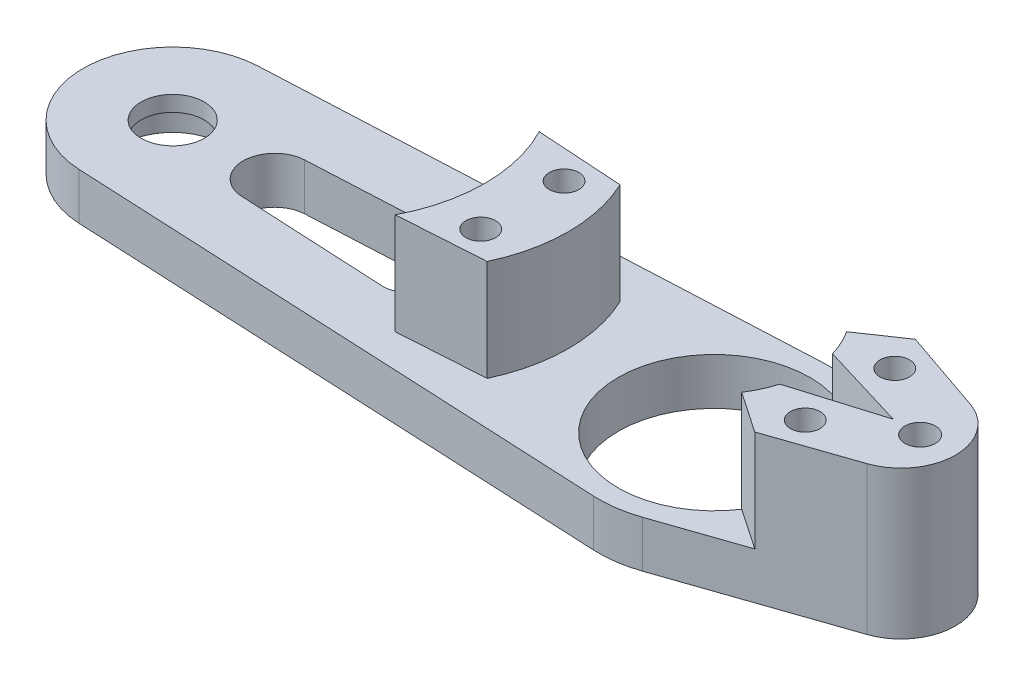
ISO-10303-21;
HEADER;
FILE_DESCRIPTION(('STEP AP214'),'2;1');
FILE_NAME('part.step','',(''),(''),'','','');
FILE_SCHEMA(('AUTOMOTIVE_DESIGN { 1 0 10303 214 1 1 1 1 }'));
ENDSEC;
DATA;
#1=APPLICATION_CONTEXT('core data for automotive mechanical design processes');
#2=APPLICATION_PROTOCOL_DEFINITION('international standard','automotive_design',2000,#1);
#3=PRODUCT_CONTEXT('',#1,'mechanical');
#4=PRODUCT('Part','Part','',(#3));
#5=PRODUCT_RELATED_PRODUCT_CATEGORY('part','',(#4));
#6=PRODUCT_DEFINITION_FORMATION('','',#4);
#7=PRODUCT_DEFINITION_CONTEXT('part definition',#1,'design');
#8=PRODUCT_DEFINITION('design','',#6,#7);
#9=PRODUCT_DEFINITION_SHAPE('','',#8);
#10=(LENGTH_UNIT() NAMED_UNIT(*) SI_UNIT(.MILLI.,.METRE.));
#11=(NAMED_UNIT(*) PLANE_ANGLE_UNIT() SI_UNIT($,.RADIAN.));
#12=(NAMED_UNIT(*) SI_UNIT($,.STERADIAN.) SOLID_ANGLE_UNIT());
#13=UNCERTAINTY_MEASURE_WITH_UNIT(LENGTH_MEASURE(1.E-05),#10,'distance_accuracy_value','');
#14=(GEOMETRIC_REPRESENTATION_CONTEXT(3) GLOBAL_UNCERTAINTY_ASSIGNED_CONTEXT((#13)) GLOBAL_UNIT_ASSIGNED_CONTEXT((#10,
#11,#12)) REPRESENTATION_CONTEXT('',''));
#15=CARTESIAN_POINT('',(0.,0.,0.));
#16=DIRECTION('',(0.,0.,1.));
#17=DIRECTION('',(1.,0.,0.));
#18=AXIS2_PLACEMENT_3D('',#15,#16,#17);
#19=CARTESIAN_POINT('',(0.,6.,0.));
#20=DIRECTION('',(0.,1.,0.));
#21=DIRECTION('',(0.,0.,1.));
#22=AXIS2_PLACEMENT_3D('',#19,#20,#21);
#23=PLANE('',#22);
#24=DIRECTION('',(-0.997936865079172,0.,-0.0642029073792971));
#25=VECTOR('',#24,1.);
#26=CARTESIAN_POINT('',(37.8102487579293,6.,-9.24346624898723));
#27=LINE('',#26,#25);
#28=CARTESIAN_POINT('',(48.9,6.,-8.53));
#29=VERTEX_POINT('',#28);
#30=CARTESIAN_POINT('',(37.8102487579293,6.,-9.24346624898723));
#31=VERTEX_POINT('',#30);
#32=EDGE_CURVE('E298',#29,#31,#27,.T.);
#33=ORIENTED_EDGE('',*,*,#32,.F.);
#34=CARTESIAN_POINT('',(30.8102487579293,6.,0.));
#35=DIRECTION('',(0.,1.,0.));
#36=DIRECTION('',(0.,0.,1.));
#37=AXIS2_PLACEMENT_3D('',#34,#35,#36);
#38=CIRCLE('',#37,20.);
#39=CARTESIAN_POINT('',(48.9,6.,8.53));
#40=VERTEX_POINT('',#39);
#41=EDGE_CURVE('E284',#40,#29,#38,.T.);
#42=ORIENTED_EDGE('',*,*,#41,.F.);
#43=DIRECTION('',(0.997936865079172,0.,-0.0642029073792968));
#44=VECTOR('',#43,1.);
#45=CARTESIAN_POINT('',(37.8102487579293,6.,9.24346624898723));
#46=LINE('',#45,#44);
#47=CARTESIAN_POINT('',(37.8102487579293,6.,9.24346624898723));
#48=VERTEX_POINT('',#47);
#49=EDGE_CURVE('E289',#48,#40,#46,.T.);
#50=ORIENTED_EDGE('',*,*,#49,.F.);
#51=CARTESIAN_POINT('',(20.0744563678545,6.,0.));
#52=DIRECTION('',(0.,-1.,0.));
#53=DIRECTION('',(0.,0.,1.));
#54=AXIS2_PLACEMENT_3D('',#51,#52,#53);
#55=CIRCLE('',#54,20.);
#56=EDGE_CURVE('E300',#31,#48,#55,.T.);
#57=ORIENTED_EDGE('',*,*,#56,.F.);
#58=EDGE_LOOP('',(#33,#42,#50,#57));
#59=FACE_BOUND('',#58,.T.);
#60=CARTESIAN_POINT('',(13.1,6.,0.));
#61=DIRECTION('',(0.,1.,0.));
#62=DIRECTION('',(0.,0.,1.));
#63=AXIS2_PLACEMENT_3D('',#60,#61,#62);
#64=CIRCLE('',#63,4.05);
#65=CARTESIAN_POINT('',(12.8981621805094,6.,-4.04496742812884));
#66=VERTEX_POINT('',#65);
#67=CARTESIAN_POINT('',(12.8981621805094,6.,4.04496742812884));
#68=VERTEX_POINT('',#67);
#69=EDGE_CURVE('E335',#66,#68,#64,.T.);
#70=ORIENTED_EDGE('',*,*,#69,.F.);
#71=DIRECTION('',(0.998757389661443,0.,-0.0498364986396635));
#72=VECTOR('',#71,1.);
#73=CARTESIAN_POINT('',(-0.169301656074376,6.,-3.39292054421391));
#74=LINE('',#73,#72);
#75=CARTESIAN_POINT('',(31.9754087534008,6.,-4.99689347415361));
#76=VERTEX_POINT('',#75);
#77=EDGE_CURVE('E338',#66,#76,#74,.T.);
#78=ORIENTED_EDGE('',*,*,#77,.T.);
#79=CARTESIAN_POINT('',(32.1,6.,-2.5));
#80=DIRECTION('',(0.,1.,0.));
#81=DIRECTION('',(0.,0.,1.));
#82=AXIS2_PLACEMENT_3D('',#79,#80,#81);
#83=CIRCLE('',#82,2.5);
#84=CARTESIAN_POINT('',(34.6,6.,-2.5));
#85=VERTEX_POINT('',#84);
#86=EDGE_CURVE('E340',#85,#76,#83,.T.);
#87=ORIENTED_EDGE('',*,*,#86,.F.);
#88=DIRECTION('',(0.,0.,1.));
#89=VECTOR('',#88,1.);
#90=CARTESIAN_POINT('',(34.6,6.,0.));
#91=LINE('',#90,#89);
#92=CARTESIAN_POINT('',(34.6,6.,2.5));
#93=VERTEX_POINT('',#92);
#94=EDGE_CURVE('E343',#85,#93,#91,.T.);
#95=ORIENTED_EDGE('',*,*,#94,.T.);
#96=CARTESIAN_POINT('',(32.1,6.,2.5));
#97=DIRECTION('',(0.,1.,0.));
#98=DIRECTION('',(0.,0.,1.));
#99=AXIS2_PLACEMENT_3D('',#96,#97,#98);
#100=CIRCLE('',#99,2.5);
#101=CARTESIAN_POINT('',(31.9754087534008,6.,4.99689347415361));
#102=VERTEX_POINT('',#101);
#103=EDGE_CURVE('E345',#102,#93,#100,.T.);
#104=ORIENTED_EDGE('',*,*,#103,.F.);
#105=DIRECTION('',(-0.998757389661443,0.,-0.0498364986396635));
#106=VECTOR('',#105,1.);
#107=CARTESIAN_POINT('',(-0.169301656074376,6.,3.39292054421391));
#108=LINE('',#107,#106);
#109=EDGE_CURVE('E348',#102,#68,#108,.T.);
#110=ORIENTED_EDGE('',*,*,#109,.T.);
#111=EDGE_LOOP('',(#70,#78,#87,#95,#104,#110));
#112=FACE_BOUND('',#111,.T.);
#113=CARTESIAN_POINT('',(0.,6.,0.));
#114=DIRECTION('',(0.,1.,0.));
#115=DIRECTION('',(0.,0.,1.));
#116=AXIS2_PLACEMENT_3D('',#113,#114,#115);
#117=CIRCLE('',#116,4.05);
#118=CARTESIAN_POINT('',(0.,6.,4.05));
#119=VERTEX_POINT('',#118);
#120=EDGE_CURVE('E350',#119,#119,#117,.T.);
#121=ORIENTED_EDGE('',*,*,#120,.F.);
#122=EDGE_LOOP('',(#121));
#123=FACE_BOUND('',#122,.T.);
#124=CARTESIAN_POINT('',(69.5,6.,0.));
#125=DIRECTION('',(0.,1.,0.));
#126=DIRECTION('',(0.,0.,1.));
#127=AXIS2_PLACEMENT_3D('',#124,#125,#126);
#128=CIRCLE('',#127,12.3);
#129=CARTESIAN_POINT('',(79.7909125879284,6.,-6.73699622291838));
#130=VERTEX_POINT('',#129);
#131=CARTESIAN_POINT('',(79.7909125879284,6.,6.73699622291837));
#132=VERTEX_POINT('',#131);
#133=EDGE_CURVE('E353',#130,#132,#128,.T.);
#134=ORIENTED_EDGE('',*,*,#133,.F.);
#135=DIRECTION('',(-0.826911337757205,0.,0.562332321219925));
#136=VECTOR('',#135,1.);
#137=CARTESIAN_POINT('',(85.0425,6.,-10.3082827740609));
#138=LINE('',#137,#136);
#139=CARTESIAN_POINT('',(85.0425,6.,-10.3082827740609));
#140=VERTEX_POINT('',#139);
#141=EDGE_CURVE('E54',#140,#130,#138,.T.);
#142=ORIENTED_EDGE('',*,*,#141,.F.);
#143=DIRECTION('',(0.945714015968887,0.,0.325000000000001));
#144=VECTOR('',#143,1.);
#145=CARTESIAN_POINT('',(12.1509375,6.,-35.3578827720368));
#146=LINE('',#145,#144);
#147=CARTESIAN_POINT('',(74.31,6.,-13.9965674363395));
#148=VERTEX_POINT('',#147);
#149=EDGE_CURVE('E327',#148,#140,#146,.T.);
#150=ORIENTED_EDGE('',*,*,#149,.F.);
#151=CARTESIAN_POINT('',(69.5,6.,0.));
#152=DIRECTION('',(0.,1.,0.));
#153=DIRECTION('',(0.,0.,1.));
#154=AXIS2_PLACEMENT_3D('',#151,#152,#153);
#155=CIRCLE('',#154,14.8);
#156=CARTESIAN_POINT('',(68.7972661870504,6.,-14.7833069774032));
#157=VERTEX_POINT('',#156);
#158=EDGE_CURVE('E324',#148,#157,#155,.T.);
#159=ORIENTED_EDGE('',*,*,#158,.T.);
#160=DIRECTION('',(0.998872093067782,0.,-0.0474820143884893));
#161=VECTOR('',#160,1.);
#162=CARTESIAN_POINT('',(-0.546043165467626,6.,-11.4870290702795));
#163=LINE('',#162,#161);
#164=CARTESIAN_POINT('',(-0.546043165467626,6.,-11.4870290702795));
#165=VERTEX_POINT('',#164);
#166=EDGE_CURVE('E330',#165,#157,#163,.T.);
#167=ORIENTED_EDGE('',*,*,#166,.F.);
#168=CARTESIAN_POINT('',(0.,6.,0.));
#169=DIRECTION('',(0.,1.,0.));
#170=DIRECTION('',(0.,0.,1.));
#171=AXIS2_PLACEMENT_3D('',#168,#169,#170);
#172=CIRCLE('',#171,11.5);
#173=CARTESIAN_POINT('',(-0.546043165467626,6.,11.4870290702795));
#174=VERTEX_POINT('',#173);
#175=EDGE_CURVE('E333',#165,#174,#172,.T.);
#176=ORIENTED_EDGE('',*,*,#175,.T.);
#177=DIRECTION('',(0.998872093067782,0.,0.0474820143884893));
#178=VECTOR('',#177,1.);
#179=CARTESIAN_POINT('',(-0.546043165467626,6.,11.4870290702795));
#180=LINE('',#179,#178);
#181=CARTESIAN_POINT('',(68.7972661870504,6.,14.7833069774032));
#182=VERTEX_POINT('',#181);
#183=EDGE_CURVE('E317',#174,#182,#180,.T.);
#184=ORIENTED_EDGE('',*,*,#183,.T.);
#185=CARTESIAN_POINT('',(74.31,6.,13.9965674363395));
#186=VERTEX_POINT('',#185);
#187=EDGE_CURVE('E320',#182,#186,#155,.T.);
#188=ORIENTED_EDGE('',*,*,#187,.T.);
#189=DIRECTION('',(0.945714015968887,0.,-0.325));
#190=VECTOR('',#189,1.);
#191=CARTESIAN_POINT('',(12.1509375,6.,35.3578827720368));
#192=LINE('',#191,#190);
#193=CARTESIAN_POINT('',(85.0425,6.,10.3082827740609));
#194=VERTEX_POINT('',#193);
#195=EDGE_CURVE('E323',#186,#194,#192,.T.);
#196=ORIENTED_EDGE('',*,*,#195,.T.);
#197=DIRECTION('',(0.826911337757205,0.,0.562332321219926));
#198=VECTOR('',#197,1.);
#199=CARTESIAN_POINT('',(85.0425,6.,10.3082827740609));
#200=LINE('',#199,#198);
#201=EDGE_CURVE('E261',#132,#194,#200,.T.);
#202=ORIENTED_EDGE('',*,*,#201,.F.);
#203=EDGE_LOOP('',(#134,#142,#150,#159,#167,#176,#184,#188,#196,#202));
#204=FACE_BOUND('',#203,.T.);
#205=ADVANCED_FACE('F37',(#59,#112,#123,#204),#23,.T.);
#206=CARTESIAN_POINT('',(81.3244908595363,6.,3.38694787570511));
#207=VERTEX_POINT('',#206);
#208=CARTESIAN_POINT('',(81.3244908595363,6.,-3.3869478757051));
#209=VERTEX_POINT('',#208);
#210=EDGE_CURVE('E215',#207,#209,#128,.T.);
#211=ORIENTED_EDGE('',*,*,#210,.F.);
#212=DIRECTION('',(-0.957014184907747,0.,0.290041117577078));
#213=VECTOR('',#212,1.);
#214=CARTESIAN_POINT('',(81.3244908595363,6.,3.38694787570511));
#215=LINE('',#214,#213);
#216=CARTESIAN_POINT('',(92.5,6.,0.));
#217=VERTEX_POINT('',#216);
#218=EDGE_CURVE('E258',#217,#207,#215,.T.);
#219=ORIENTED_EDGE('',*,*,#218,.F.);
#220=DIRECTION('',(0.957014184907747,0.,0.290041117577078));
#221=VECTOR('',#220,1.);
#222=CARTESIAN_POINT('',(92.5,6.,0.));
#223=LINE('',#222,#221);
#224=EDGE_CURVE('E228',#209,#217,#223,.T.);
#225=ORIENTED_EDGE('',*,*,#224,.F.);
#226=EDGE_LOOP('',(#211,#219,#225));
#227=FACE_BOUND('',#226,.T.);
#228=ADVANCED_FACE('F487',(#227),#23,.T.);
#229=CARTESIAN_POINT('',(13.1,6.,0.));
#230=DIRECTION('',(0.,-1.,0.));
#231=DIRECTION('',(0.,0.,-1.));
#232=AXIS2_PLACEMENT_3D('',#229,#230,#231);
#233=CYLINDRICAL_SURFACE('',#232,4.05);
#234=CARTESIAN_POINT('',(13.1,0.,0.));
#235=DIRECTION('',(0.,1.,0.));
#236=DIRECTION('',(0.,0.,1.));
#237=AXIS2_PLACEMENT_3D('',#234,#235,#236);
#238=CIRCLE('',#237,4.05);
#239=CARTESIAN_POINT('',(12.8981621805094,0.,-4.04496742812884));
#240=VERTEX_POINT('',#239);
#241=CARTESIAN_POINT('',(12.8981621805094,0.,4.04496742812884));
#242=VERTEX_POINT('',#241);
#243=EDGE_CURVE('E374',#240,#242,#238,.T.);
#244=ORIENTED_EDGE('',*,*,#243,.F.);
#245=DIRECTION('',(0.,-1.,0.));
#246=VECTOR('',#245,1.);
#247=CARTESIAN_POINT('',(12.8981621805094,6.,-4.04496742812884));
#248=LINE('',#247,#246);
#249=EDGE_CURVE('E12',#66,#240,#248,.T.);
#250=ORIENTED_EDGE('',*,*,#249,.F.);
#251=ORIENTED_EDGE('',*,*,#69,.T.);
#252=DIRECTION('',(0.,-1.,0.));
#253=VECTOR('',#252,1.);
#254=CARTESIAN_POINT('',(12.8981621805094,6.,4.04496742812884));
#255=LINE('',#254,#253);
#256=EDGE_CURVE('E409',#68,#242,#255,.T.);
#257=ORIENTED_EDGE('',*,*,#256,.T.);
#258=EDGE_LOOP('',(#244,#250,#251,#257));
#259=FACE_BOUND('',#258,.T.);
#260=ADVANCED_FACE('F489',(#259),#233,.F.);
#261=CARTESIAN_POINT('',(-0.169301656074376,6.,-3.39292054421391));
#262=DIRECTION('',(-0.0498364986396635,0.,-0.998757389661442));
#263=DIRECTION('',(-0.998757389661443,0.,0.0498364986396635));
#264=AXIS2_PLACEMENT_3D('',#261,#262,#263);
#265=PLANE('',#264);
#266=DIRECTION('',(0.998757389661443,0.,-0.0498364986396635));
#267=VECTOR('',#266,1.);
#268=CARTESIAN_POINT('',(-0.169301656074376,0.,-3.39292054421391));
#269=LINE('',#268,#267);
#270=CARTESIAN_POINT('',(31.9754087534008,0.,-4.99689347415361));
#271=VERTEX_POINT('',#270);
#272=EDGE_CURVE('E377',#240,#271,#269,.T.);
#273=ORIENTED_EDGE('',*,*,#272,.T.);
#274=DIRECTION('',(0.,-1.,0.));
#275=VECTOR('',#274,1.);
#276=CARTESIAN_POINT('',(31.9754087534008,6.,-4.99689347415361));
#277=LINE('',#276,#275);
#278=EDGE_CURVE('E46',#76,#271,#277,.T.);
#279=ORIENTED_EDGE('',*,*,#278,.F.);
#280=ORIENTED_EDGE('',*,*,#77,.F.);
#281=ORIENTED_EDGE('',*,*,#249,.T.);
#282=EDGE_LOOP('',(#273,#279,#280,#281));
#283=FACE_BOUND('',#282,.T.);
#284=ADVANCED_FACE('F495',(#283),#265,.F.);
#285=CARTESIAN_POINT('',(32.1,6.,-2.5));
#286=DIRECTION('',(0.,-1.,0.));
#287=DIRECTION('',(0.,0.,-1.));
#288=AXIS2_PLACEMENT_3D('',#285,#286,#287);
#289=CYLINDRICAL_SURFACE('',#288,2.5);
#290=CARTESIAN_POINT('',(32.1,0.,-2.5));
#291=DIRECTION('',(0.,1.,0.));
#292=DIRECTION('',(0.,0.,1.));
#293=AXIS2_PLACEMENT_3D('',#290,#291,#292);
#294=CIRCLE('',#293,2.5);
#295=CARTESIAN_POINT('',(34.6,0.,-2.5));
#296=VERTEX_POINT('',#295);
#297=EDGE_CURVE('E380',#296,#271,#294,.T.);
#298=ORIENTED_EDGE('',*,*,#297,.F.);
#299=DIRECTION('',(0.,-1.,0.));
#300=VECTOR('',#299,1.);
#301=CARTESIAN_POINT('',(34.6,6.,-2.5));
#302=LINE('',#301,#300);
#303=EDGE_CURVE('E416',#85,#296,#302,.T.);
#304=ORIENTED_EDGE('',*,*,#303,.F.);
#305=ORIENTED_EDGE('',*,*,#86,.T.);
#306=ORIENTED_EDGE('',*,*,#278,.T.);
#307=EDGE_LOOP('',(#298,#304,#305,#306));
#308=FACE_BOUND('',#307,.T.);
#309=ADVANCED_FACE('F544',(#308),#289,.F.);
#310=CARTESIAN_POINT('',(34.6,6.,0.));
#311=DIRECTION('',(1.,0.,0.));
#312=DIRECTION('',(0.,0.,-1.));
#313=AXIS2_PLACEMENT_3D('',#310,#311,#312);
#314=PLANE('',#313);
#315=DIRECTION('',(0.,0.,1.));
#316=VECTOR('',#315,1.);
#317=CARTESIAN_POINT('',(34.6,0.,0.));
#318=LINE('',#317,#316);
#319=CARTESIAN_POINT('',(34.6,0.,2.5));
#320=VERTEX_POINT('',#319);
#321=EDGE_CURVE('E383',#296,#320,#318,.T.);
#322=ORIENTED_EDGE('',*,*,#321,.T.);
#323=DIRECTION('',(0.,-1.,0.));
#324=VECTOR('',#323,1.);
#325=CARTESIAN_POINT('',(34.6,6.,2.5));
#326=LINE('',#325,#324);
#327=EDGE_CURVE('E414',#93,#320,#326,.T.);
#328=ORIENTED_EDGE('',*,*,#327,.F.);
#329=ORIENTED_EDGE('',*,*,#94,.F.);
#330=ORIENTED_EDGE('',*,*,#303,.T.);
#331=EDGE_LOOP('',(#322,#328,#329,#330));
#332=FACE_BOUND('',#331,.T.);
#333=ADVANCED_FACE('F540',(#332),#314,.F.);
#334=CARTESIAN_POINT('',(32.1,6.,2.5));
#335=DIRECTION('',(0.,-1.,0.));
#336=DIRECTION('',(0.,0.,-1.));
#337=AXIS2_PLACEMENT_3D('',#334,#335,#336);
#338=CYLINDRICAL_SURFACE('',#337,2.5);
#339=CARTESIAN_POINT('',(32.1,0.,2.5));
#340=DIRECTION('',(0.,1.,0.));
#341=DIRECTION('',(0.,0.,1.));
#342=AXIS2_PLACEMENT_3D('',#339,#340,#341);
#343=CIRCLE('',#342,2.5);
#344=CARTESIAN_POINT('',(31.9754087534008,0.,4.99689347415361));
#345=VERTEX_POINT('',#344);
#346=EDGE_CURVE('E386',#345,#320,#343,.T.);
#347=ORIENTED_EDGE('',*,*,#346,.F.);
#348=DIRECTION('',(0.,-1.,0.));
#349=VECTOR('',#348,1.);
#350=CARTESIAN_POINT('',(31.9754087534008,6.,4.99689347415361));
#351=LINE('',#350,#349);
#352=EDGE_CURVE('E411',#102,#345,#351,.T.);
#353=ORIENTED_EDGE('',*,*,#352,.F.);
#354=ORIENTED_EDGE('',*,*,#103,.T.);
#355=ORIENTED_EDGE('',*,*,#327,.T.);
#356=EDGE_LOOP('',(#347,#353,#354,#355));
#357=FACE_BOUND('',#356,.T.);
#358=ADVANCED_FACE('F537',(#357),#338,.F.);
#359=CARTESIAN_POINT('',(-0.546043165467626,6.,11.4870290702795));
#360=DIRECTION('',(0.0474820143884892,0.,-0.998872093067782));
#361=DIRECTION('',(-0.998872093067782,0.,-0.0474820143884893));
#362=AXIS2_PLACEMENT_3D('',#359,#360,#361);
#363=PLANE('',#362);
#364=DIRECTION('',(0.998872093067782,0.,0.0474820143884893));
#365=VECTOR('',#364,1.);
#366=CARTESIAN_POINT('',(-0.546043165467626,0.,11.4870290702795));
#367=LINE('',#366,#365);
#368=CARTESIAN_POINT('',(-0.546043165467626,0.,11.4870290702795));
#369=VERTEX_POINT('',#368);
#370=CARTESIAN_POINT('',(68.7972661870504,0.,14.7833069774032));
#371=VERTEX_POINT('',#370);
#372=EDGE_CURVE('E355',#369,#371,#367,.T.);
#373=ORIENTED_EDGE('',*,*,#372,.T.);
#374=DIRECTION('',(0.,-1.,0.));
#375=VECTOR('',#374,1.);
#376=CARTESIAN_POINT('',(68.7972661870504,6.,14.7833069774032));
#377=LINE('',#376,#375);
#378=EDGE_CURVE('E412',#182,#371,#377,.T.);
#379=ORIENTED_EDGE('',*,*,#378,.F.);
#380=ORIENTED_EDGE('',*,*,#183,.F.);
#381=DIRECTION('',(0.,-1.,0.));
#382=VECTOR('',#381,1.);
#383=CARTESIAN_POINT('',(-0.546043165467626,6.,11.4870290702795));
#384=LINE('',#383,#382);
#385=EDGE_CURVE('E419',#174,#369,#384,.T.);
#386=ORIENTED_EDGE('',*,*,#385,.T.);
#387=EDGE_LOOP('',(#373,#379,#380,#386));
#388=FACE_BOUND('',#387,.T.);
#389=ADVANCED_FACE('F39',(#388),#363,.F.);
#390=CARTESIAN_POINT('',(69.5,6.,0.));
#391=DIRECTION('',(0.,-1.,0.));
#392=DIRECTION('',(0.,0.,-1.));
#393=AXIS2_PLACEMENT_3D('',#390,#391,#392);
#394=CYLINDRICAL_SURFACE('',#393,14.8);
#395=CARTESIAN_POINT('',(69.5,0.,0.));
#396=DIRECTION('',(0.,1.,0.));
#397=DIRECTION('',(0.,0.,1.));
#398=AXIS2_PLACEMENT_3D('',#395,#396,#397);
#399=CIRCLE('',#398,14.8);
#400=CARTESIAN_POINT('',(74.31,0.,13.9965674363395));
#401=VERTEX_POINT('',#400);
#402=EDGE_CURVE('E358',#371,#401,#399,.T.);
#403=ORIENTED_EDGE('',*,*,#402,.T.);
#404=DIRECTION('',(0.,-1.,0.));
#405=VECTOR('',#404,1.);
#406=CARTESIAN_POINT('',(74.31,6.,13.9965674363395));
#407=LINE('',#406,#405);
#408=EDGE_CURVE('E433',#186,#401,#407,.T.);
#409=ORIENTED_EDGE('',*,*,#408,.F.);
#410=ORIENTED_EDGE('',*,*,#187,.F.);
#411=ORIENTED_EDGE('',*,*,#378,.T.);
#412=EDGE_LOOP('',(#403,#409,#410,#411));
#413=FACE_BOUND('',#412,.T.);
#414=ADVANCED_FACE('F438',(#413),#394,.T.);
#415=CARTESIAN_POINT('',(12.1509375,6.,35.3578827720368));
#416=DIRECTION('',(-0.325,0.,-0.945714015968887));
#417=DIRECTION('',(-0.945714015968887,0.,0.325));
#418=AXIS2_PLACEMENT_3D('',#415,#416,#417);
#419=PLANE('',#418);
#420=DIRECTION('',(0.945714015968887,0.,-0.325));
#421=VECTOR('',#420,1.);
#422=CARTESIAN_POINT('',(12.1509375,0.,35.3578827720368));
#423=LINE('',#422,#421);
#424=CARTESIAN_POINT('',(95.775,0.,6.61999811178221));
#425=VERTEX_POINT('',#424);
#426=EDGE_CURVE('E360',#401,#425,#423,.T.);
#427=ORIENTED_EDGE('',*,*,#426,.T.);
#428=DIRECTION('',(0.,-1.,0.));
#429=VECTOR('',#428,1.);
#430=CARTESIAN_POINT('',(95.775,6.,6.61999811178221));
#431=LINE('',#430,#429);
#432=CARTESIAN_POINT('',(95.775,19.,6.61999811178221));
#433=VERTEX_POINT('',#432);
#434=EDGE_CURVE('E430',#433,#425,#431,.T.);
#435=ORIENTED_EDGE('',*,*,#434,.F.);
#436=DIRECTION('',(0.945714015968887,0.,-0.325));
#437=VECTOR('',#436,1.);
#438=CARTESIAN_POINT('',(85.0425,19.,10.3082827740609));
#439=LINE('',#438,#437);
#440=CARTESIAN_POINT('',(85.0425,19.,10.3082827740609));
#441=VERTEX_POINT('',#440);
#442=EDGE_CURVE('E247',#441,#433,#439,.T.);
#443=ORIENTED_EDGE('',*,*,#442,.F.);
#444=DIRECTION('',(0.,-1.,0.));
#445=VECTOR('',#444,1.);
#446=CARTESIAN_POINT('',(85.0425,48.2217226809239,10.3082827740609));
#447=LINE('',#446,#445);
#448=EDGE_CURVE('E268',#441,#194,#447,.T.);
#449=ORIENTED_EDGE('',*,*,#448,.T.);
#450=ORIENTED_EDGE('',*,*,#195,.F.);
#451=ORIENTED_EDGE('',*,*,#408,.T.);
#452=EDGE_LOOP('',(#427,#435,#443,#449,#450,#451));
#453=FACE_BOUND('',#452,.T.);
#454=ADVANCED_FACE('F452',(#453),#419,.F.);
#455=CARTESIAN_POINT('',(93.5,6.,0.));
#456=DIRECTION('',(0.,-1.,0.));
#457=DIRECTION('',(0.,0.,-1.));
#458=AXIS2_PLACEMENT_3D('',#455,#456,#457);
#459=CYLINDRICAL_SURFACE('',#458,7.);
#460=CARTESIAN_POINT('',(93.5,0.,0.));
#461=DIRECTION('',(0.,1.,0.));
#462=DIRECTION('',(0.,0.,1.));
#463=AXIS2_PLACEMENT_3D('',#460,#461,#462);
#464=CIRCLE('',#463,7.);
#465=CARTESIAN_POINT('',(95.775,0.,-6.6199981117822));
#466=VERTEX_POINT('',#465);
#467=EDGE_CURVE('E363',#425,#466,#464,.T.);
#468=ORIENTED_EDGE('',*,*,#467,.T.);
#469=DIRECTION('',(0.,-1.,0.));
#470=VECTOR('',#469,1.);
#471=CARTESIAN_POINT('',(95.775,6.,-6.6199981117822));
#472=LINE('',#471,#470);
#473=CARTESIAN_POINT('',(95.775,19.,-6.6199981117822));
#474=VERTEX_POINT('',#473);
#475=EDGE_CURVE('E428',#474,#466,#472,.T.);
#476=ORIENTED_EDGE('',*,*,#475,.F.);
#477=CARTESIAN_POINT('',(93.5,19.,0.));
#478=DIRECTION('',(0.,1.,0.));
#479=DIRECTION('',(0.,0.,1.));
#480=AXIS2_PLACEMENT_3D('',#477,#478,#479);
#481=CIRCLE('',#480,6.99999999999999);
#482=EDGE_CURVE('E244',#433,#474,#481,.T.);
#483=ORIENTED_EDGE('',*,*,#482,.F.);
#484=ORIENTED_EDGE('',*,*,#434,.T.);
#485=EDGE_LOOP('',(#468,#476,#483,#484));
#486=FACE_BOUND('',#485,.T.);
#487=ADVANCED_FACE('F456',(#486),#459,.T.);
#488=CARTESIAN_POINT('',(12.1509375,6.,-35.3578827720368));
#489=DIRECTION('',(0.325000000000001,0.,-0.945714015968887));
#490=DIRECTION('',(-0.945714015968887,0.,-0.325000000000001));
#491=AXIS2_PLACEMENT_3D('',#488,#489,#490);
#492=PLANE('',#491);
#493=DIRECTION('',(0.945714015968887,0.,0.325000000000001));
#494=VECTOR('',#493,1.);
#495=CARTESIAN_POINT('',(12.1509375,0.,-35.3578827720368));
#496=LINE('',#495,#494);
#497=CARTESIAN_POINT('',(74.31,0.,-13.9965674363395));
#498=VERTEX_POINT('',#497);
#499=EDGE_CURVE('E366',#498,#466,#496,.T.);
#500=ORIENTED_EDGE('',*,*,#499,.F.);
#501=DIRECTION('',(0.,-1.,0.));
#502=VECTOR('',#501,1.);
#503=CARTESIAN_POINT('',(74.31,6.,-13.9965674363395));
#504=LINE('',#503,#502);
#505=EDGE_CURVE('E426',#148,#498,#504,.T.);
#506=ORIENTED_EDGE('',*,*,#505,.F.);
#507=ORIENTED_EDGE('',*,*,#149,.T.);
#508=DIRECTION('',(0.,-1.,0.));
#509=VECTOR('',#508,1.);
#510=CARTESIAN_POINT('',(85.0425,48.2217226809239,-10.3082827740609));
#511=LINE('',#510,#509);
#512=CARTESIAN_POINT('',(85.0425,19.,-10.3082827740609));
#513=VERTEX_POINT('',#512);
#514=EDGE_CURVE('E266',#513,#140,#511,.T.);
#515=ORIENTED_EDGE('',*,*,#514,.F.);
#516=DIRECTION('',(-0.945714015968887,0.,-0.325));
#517=VECTOR('',#516,1.);
#518=CARTESIAN_POINT('',(85.0425,19.,-10.3082827740609));
#519=LINE('',#518,#517);
#520=EDGE_CURVE('E236',#474,#513,#519,.T.);
#521=ORIENTED_EDGE('',*,*,#520,.F.);
#522=ORIENTED_EDGE('',*,*,#475,.T.);
#523=EDGE_LOOP('',(#500,#506,#507,#515,#521,#522));
#524=FACE_BOUND('',#523,.T.);
#525=ADVANCED_FACE('F477',(#524),#492,.T.);
#526=CARTESIAN_POINT('',(68.7972661870504,0.,-14.7833069774032));
#527=VERTEX_POINT('',#526);
#528=EDGE_CURVE('E361',#498,#527,#399,.T.);
#529=ORIENTED_EDGE('',*,*,#528,.T.);
#530=DIRECTION('',(0.,-1.,0.));
#531=VECTOR('',#530,1.);
#532=CARTESIAN_POINT('',(68.7972661870504,6.,-14.7833069774032));
#533=LINE('',#532,#531);
#534=EDGE_CURVE('E424',#157,#527,#533,.T.);
#535=ORIENTED_EDGE('',*,*,#534,.F.);
#536=ORIENTED_EDGE('',*,*,#158,.F.);
#537=ORIENTED_EDGE('',*,*,#505,.T.);
#538=EDGE_LOOP('',(#529,#535,#536,#537));
#539=FACE_BOUND('',#538,.T.);
#540=ADVANCED_FACE('F556',(#539),#394,.T.);
#541=CARTESIAN_POINT('',(-0.546043165467626,6.,-11.4870290702795));
#542=DIRECTION('',(-0.0474820143884892,0.,-0.998872093067782));
#543=DIRECTION('',(-0.998872093067782,0.,0.0474820143884893));
#544=AXIS2_PLACEMENT_3D('',#541,#542,#543);
#545=PLANE('',#544);
#546=DIRECTION('',(0.998872093067782,0.,-0.0474820143884893));
#547=VECTOR('',#546,1.);
#548=CARTESIAN_POINT('',(-0.546043165467626,0.,-11.4870290702795));
#549=LINE('',#548,#547);
#550=CARTESIAN_POINT('',(-0.546043165467626,0.,-11.4870290702795));
#551=VERTEX_POINT('',#550);
#552=EDGE_CURVE('E369',#551,#527,#549,.T.);
#553=ORIENTED_EDGE('',*,*,#552,.F.);
#554=DIRECTION('',(0.,-1.,0.));
#555=VECTOR('',#554,1.);
#556=CARTESIAN_POINT('',(-0.546043165467626,6.,-11.4870290702795));
#557=LINE('',#556,#555);
#558=EDGE_CURVE('E422',#165,#551,#557,.T.);
#559=ORIENTED_EDGE('',*,*,#558,.F.);
#560=ORIENTED_EDGE('',*,*,#166,.T.);
#561=ORIENTED_EDGE('',*,*,#534,.T.);
#562=EDGE_LOOP('',(#553,#559,#560,#561));
#563=FACE_BOUND('',#562,.T.);
#564=ADVANCED_FACE('F470',(#563),#545,.T.);
#565=CARTESIAN_POINT('',(86.96,6.,5.75));
#566=DIRECTION('',(0.,-1.,0.));
#567=DIRECTION('',(0.,0.,-1.));
#568=AXIS2_PLACEMENT_3D('',#565,#566,#567);
#569=CYLINDRICAL_SURFACE('',#568,1.9);
#570=CARTESIAN_POINT('',(86.96,0.,5.75));
#571=DIRECTION('',(0.,1.,0.));
#572=DIRECTION('',(0.,0.,1.));
#573=AXIS2_PLACEMENT_3D('',#570,#571,#572);
#574=CIRCLE('',#573,1.9);
#575=CARTESIAN_POINT('',(86.96,0.,7.65));
#576=VERTEX_POINT('',#575);
#577=EDGE_CURVE('E404',#576,#576,#574,.T.);
#578=ORIENTED_EDGE('',*,*,#577,.F.);
#579=EDGE_LOOP('',(#578));
#580=FACE_BOUND('',#579,.T.);
#581=CARTESIAN_POINT('',(86.96,19.,5.75));
#582=DIRECTION('',(0.,1.,0.));
#583=DIRECTION('',(0.,0.,1.));
#584=AXIS2_PLACEMENT_3D('',#581,#582,#583);
#585=CIRCLE('',#584,1.9);
#586=CARTESIAN_POINT('',(86.96,19.,7.65));
#587=VERTEX_POINT('',#586);
#588=EDGE_CURVE('E239',#587,#587,#585,.T.);
#589=ORIENTED_EDGE('',*,*,#588,.T.);
#590=EDGE_LOOP('',(#589));
#591=FACE_BOUND('',#590,.T.);
#592=ADVANCED_FACE('F511',(#580,#591),#569,.F.);
#593=CARTESIAN_POINT('',(95.96,6.,0.));
#594=DIRECTION('',(0.,-1.,0.));
#595=DIRECTION('',(0.,0.,-1.));
#596=AXIS2_PLACEMENT_3D('',#593,#594,#595);
#597=CYLINDRICAL_SURFACE('',#596,1.95);
#598=CARTESIAN_POINT('',(95.96,0.,0.));
#599=DIRECTION('',(0.,1.,0.));
#600=DIRECTION('',(0.,0.,1.));
#601=AXIS2_PLACEMENT_3D('',#598,#599,#600);
#602=CIRCLE('',#601,1.95);
#603=CARTESIAN_POINT('',(95.96,0.,1.95));
#604=VERTEX_POINT('',#603);
#605=EDGE_CURVE('E401',#604,#604,#602,.T.);
#606=ORIENTED_EDGE('',*,*,#605,.F.);
#607=EDGE_LOOP('',(#606));
#608=FACE_BOUND('',#607,.T.);
#609=CARTESIAN_POINT('',(95.96,19.,0.));
#610=DIRECTION('',(0.,1.,0.));
#611=DIRECTION('',(0.,0.,1.));
#612=AXIS2_PLACEMENT_3D('',#609,#610,#611);
#613=CIRCLE('',#612,1.95);
#614=CARTESIAN_POINT('',(95.96,19.,1.95));
#615=VERTEX_POINT('',#614);
#616=EDGE_CURVE('E276',#615,#615,#613,.T.);
#617=ORIENTED_EDGE('',*,*,#616,.T.);
#618=EDGE_LOOP('',(#617));
#619=FACE_BOUND('',#618,.T.);
#620=ADVANCED_FACE('F514',(#608,#619),#597,.F.);
#621=CARTESIAN_POINT('',(69.5,6.,0.));
#622=DIRECTION('',(0.,-1.,0.));
#623=DIRECTION('',(0.,0.,-1.));
#624=AXIS2_PLACEMENT_3D('',#621,#622,#623);
#625=CYLINDRICAL_SURFACE('',#624,12.3);
#626=ORIENTED_EDGE('',*,*,#133,.T.);
#627=DIRECTION('',(0.,-1.,0.));
#628=VECTOR('',#627,1.);
#629=CARTESIAN_POINT('',(79.7909125879284,48.2217226809239,6.73699622291837));
#630=LINE('',#629,#628);
#631=CARTESIAN_POINT('',(79.7909125879284,19.,6.73699622291837));
#632=VERTEX_POINT('',#631);
#633=EDGE_CURVE('E270',#632,#132,#630,.T.);
#634=ORIENTED_EDGE('',*,*,#633,.F.);
#635=CARTESIAN_POINT('',(69.5,19.,0.));
#636=DIRECTION('',(0.,1.,0.));
#637=DIRECTION('',(0.,0.,1.));
#638=AXIS2_PLACEMENT_3D('',#635,#636,#637);
#639=CIRCLE('',#638,12.3);
#640=CARTESIAN_POINT('',(81.3244908595363,19.,3.38694787570511));
#641=VERTEX_POINT('',#640);
#642=EDGE_CURVE('E253',#641,#632,#639,.F.);
#643=ORIENTED_EDGE('',*,*,#642,.F.);
#644=DIRECTION('',(0.,-1.,0.));
#645=VECTOR('',#644,1.);
#646=CARTESIAN_POINT('',(81.3244908595363,48.2217226809239,3.38694787570511));
#647=LINE('',#646,#645);
#648=EDGE_CURVE('E272',#641,#207,#647,.T.);
#649=ORIENTED_EDGE('',*,*,#648,.T.);
#650=ORIENTED_EDGE('',*,*,#210,.T.);
#651=DIRECTION('',(0.,-1.,0.));
#652=VECTOR('',#651,1.);
#653=CARTESIAN_POINT('',(81.3244908595363,48.2217226809239,-3.3869478757051));
#654=LINE('',#653,#652);
#655=CARTESIAN_POINT('',(81.3244908595363,19.,-3.3869478757051));
#656=VERTEX_POINT('',#655);
#657=EDGE_CURVE('E206',#656,#209,#654,.T.);
#658=ORIENTED_EDGE('',*,*,#657,.F.);
#659=CARTESIAN_POINT('',(69.5,19.,0.));
#660=DIRECTION('',(0.,1.,0.));
#661=DIRECTION('',(0.,0.,1.));
#662=AXIS2_PLACEMENT_3D('',#659,#660,#661);
#663=CIRCLE('',#662,12.3);
#664=CARTESIAN_POINT('',(79.7909125879284,19.,-6.73699622291837));
#665=VERTEX_POINT('',#664);
#666=EDGE_CURVE('E212',#665,#656,#663,.F.);
#667=ORIENTED_EDGE('',*,*,#666,.F.);
#668=DIRECTION('',(0.,-1.,0.));
#669=VECTOR('',#668,1.);
#670=CARTESIAN_POINT('',(79.7909125879284,48.2217226809239,-6.73699622291837));
#671=LINE('',#670,#669);
#672=EDGE_CURVE('E219',#665,#130,#671,.T.);
#673=ORIENTED_EDGE('',*,*,#672,.T.);
#674=EDGE_LOOP('',(#626,#634,#643,#649,#650,#658,#667,#673));
#675=FACE_BOUND('',#674,.T.);
#676=CARTESIAN_POINT('',(69.5,0.,0.));
#677=DIRECTION('',(0.,1.,0.));
#678=DIRECTION('',(0.,0.,1.));
#679=AXIS2_PLACEMENT_3D('',#676,#677,#678);
#680=CIRCLE('',#679,12.3);
#681=CARTESIAN_POINT('',(69.5,0.,12.3));
#682=VERTEX_POINT('',#681);
#683=EDGE_CURVE('E398',#682,#682,#680,.T.);
#684=ORIENTED_EDGE('',*,*,#683,.F.);
#685=EDGE_LOOP('',(#684));
#686=FACE_BOUND('',#685,.T.);
#687=ADVANCED_FACE('F209',(#675,#686),#625,.F.);
#688=CARTESIAN_POINT('',(44.9,6.,5.35));
#689=DIRECTION('',(0.,-1.,0.));
#690=DIRECTION('',(0.,0.,-1.));
#691=AXIS2_PLACEMENT_3D('',#688,#689,#690);
#692=CYLINDRICAL_SURFACE('',#691,1.89999999999998);
#693=CARTESIAN_POINT('',(44.9,0.,5.35));
#694=DIRECTION('',(0.,1.,0.));
#695=DIRECTION('',(0.,0.,1.));
#696=AXIS2_PLACEMENT_3D('',#693,#694,#695);
#697=CIRCLE('',#696,1.89999999999998);
#698=CARTESIAN_POINT('',(44.9,0.,7.24999999999998));
#699=VERTEX_POINT('',#698);
#700=EDGE_CURVE('E395',#699,#699,#697,.T.);
#701=ORIENTED_EDGE('',*,*,#700,.F.);
#702=EDGE_LOOP('',(#701));
#703=FACE_BOUND('',#702,.T.);
#704=CARTESIAN_POINT('',(44.9,19.,5.35));
#705=DIRECTION('',(0.,1.,0.));
#706=DIRECTION('',(0.,0.,1.));
#707=AXIS2_PLACEMENT_3D('',#704,#705,#706);
#708=CIRCLE('',#707,1.9);
#709=CARTESIAN_POINT('',(44.9,19.,7.25));
#710=VERTEX_POINT('',#709);
#711=EDGE_CURVE('E281',#710,#710,#708,.T.);
#712=ORIENTED_EDGE('',*,*,#711,.T.);
#713=EDGE_LOOP('',(#712));
#714=FACE_BOUND('',#713,.T.);
#715=ADVANCED_FACE('F521',(#703,#714),#692,.F.);
#716=CARTESIAN_POINT('',(0.,6.,0.));
#717=DIRECTION('',(0.,-1.,0.));
#718=DIRECTION('',(0.,0.,-1.));
#719=AXIS2_PLACEMENT_3D('',#716,#717,#718);
#720=CYLINDRICAL_SURFACE('',#719,4.05);
#721=CARTESIAN_POINT('',(0.,4.,0.));
#722=DIRECTION('',(0.,1.,0.));
#723=DIRECTION('',(0.,0.,1.));
#724=AXIS2_PLACEMENT_3D('',#721,#722,#723);
#725=CIRCLE('',#724,4.05);
#726=CARTESIAN_POINT('',(0.,4.,4.05));
#727=VERTEX_POINT('',#726);
#728=EDGE_CURVE('E41',#727,#727,#725,.T.);
#729=ORIENTED_EDGE('',*,*,#728,.F.);
#730=EDGE_LOOP('',(#729));
#731=FACE_BOUND('',#730,.T.);
#732=ORIENTED_EDGE('',*,*,#120,.T.);
#733=EDGE_LOOP('',(#732));
#734=FACE_BOUND('',#733,.T.);
#735=ADVANCED_FACE('F524',(#731,#734),#720,.F.);
#736=CARTESIAN_POINT('',(44.9,6.,-5.35));
#737=DIRECTION('',(0.,-1.,0.));
#738=DIRECTION('',(0.,0.,-1.));
#739=AXIS2_PLACEMENT_3D('',#736,#737,#738);
#740=CYLINDRICAL_SURFACE('',#739,1.89999999999996);
#741=CARTESIAN_POINT('',(44.9,0.,-5.35));
#742=DIRECTION('',(0.,1.,0.));
#743=DIRECTION('',(0.,0.,1.));
#744=AXIS2_PLACEMENT_3D('',#741,#742,#743);
#745=CIRCLE('',#744,1.89999999999996);
#746=CARTESIAN_POINT('',(44.9,0.,-3.45000000000004));
#747=VERTEX_POINT('',#746);
#748=EDGE_CURVE('E392',#747,#747,#745,.T.);
#749=ORIENTED_EDGE('',*,*,#748,.F.);
#750=EDGE_LOOP('',(#749));
#751=FACE_BOUND('',#750,.T.);
#752=CARTESIAN_POINT('',(44.9,19.,-5.35));
#753=DIRECTION('',(0.,1.,0.));
#754=DIRECTION('',(0.,0.,1.));
#755=AXIS2_PLACEMENT_3D('',#752,#753,#754);
#756=CIRCLE('',#755,1.9);
#757=CARTESIAN_POINT('',(44.9,19.,-3.45));
#758=VERTEX_POINT('',#757);
#759=EDGE_CURVE('E275',#758,#758,#756,.T.);
#760=ORIENTED_EDGE('',*,*,#759,.T.);
#761=EDGE_LOOP('',(#760));
#762=FACE_BOUND('',#761,.T.);
#763=ADVANCED_FACE('F528',(#751,#762),#740,.F.);
#764=CARTESIAN_POINT('',(-0.169301656074376,6.,3.39292054421391));
#765=DIRECTION('',(-0.0498364986396635,0.,0.998757389661442));
#766=DIRECTION('',(0.998757389661443,0.,0.0498364986396635));
#767=AXIS2_PLACEMENT_3D('',#764,#765,#766);
#768=PLANE('',#767);
#769=DIRECTION('',(-0.998757389661443,0.,-0.0498364986396635));
#770=VECTOR('',#769,1.);
#771=CARTESIAN_POINT('',(-0.169301656074376,0.,3.39292054421391));
#772=LINE('',#771,#770);
#773=EDGE_CURVE('E389',#345,#242,#772,.T.);
#774=ORIENTED_EDGE('',*,*,#773,.T.);
#775=ORIENTED_EDGE('',*,*,#256,.F.);
#776=ORIENTED_EDGE('',*,*,#109,.F.);
#777=ORIENTED_EDGE('',*,*,#352,.T.);
#778=EDGE_LOOP('',(#774,#775,#776,#777));
#779=FACE_BOUND('',#778,.T.);
#780=ADVANCED_FACE('F532',(#779),#768,.F.);
#781=CARTESIAN_POINT('',(0.,6.,0.));
#782=DIRECTION('',(0.,-1.,0.));
#783=DIRECTION('',(0.,0.,-1.));
#784=AXIS2_PLACEMENT_3D('',#781,#782,#783);
#785=CYLINDRICAL_SURFACE('',#784,11.5);
#786=CARTESIAN_POINT('',(0.,0.,0.));
#787=DIRECTION('',(0.,1.,0.));
#788=DIRECTION('',(0.,0.,1.));
#789=AXIS2_PLACEMENT_3D('',#786,#787,#788);
#790=CIRCLE('',#789,11.5);
#791=EDGE_CURVE('E372',#551,#369,#790,.T.);
#792=ORIENTED_EDGE('',*,*,#791,.T.);
#793=ORIENTED_EDGE('',*,*,#385,.F.);
#794=ORIENTED_EDGE('',*,*,#175,.F.);
#795=ORIENTED_EDGE('',*,*,#558,.T.);
#796=EDGE_LOOP('',(#792,#793,#794,#795));
#797=FACE_BOUND('',#796,.T.);
#798=ADVANCED_FACE('F468',(#797),#785,.T.);
#799=CARTESIAN_POINT('',(86.96,6.,-5.75));
#800=DIRECTION('',(0.,-1.,0.));
#801=DIRECTION('',(0.,0.,-1.));
#802=AXIS2_PLACEMENT_3D('',#799,#800,#801);
#803=CYLINDRICAL_SURFACE('',#802,1.9);
#804=CARTESIAN_POINT('',(86.96,0.,-5.75));
#805=DIRECTION('',(0.,1.,0.));
#806=DIRECTION('',(0.,0.,1.));
#807=AXIS2_PLACEMENT_3D('',#804,#805,#806);
#808=CIRCLE('',#807,1.9);
#809=CARTESIAN_POINT('',(86.96,0.,-3.85));
#810=VERTEX_POINT('',#809);
#811=EDGE_CURVE('E321',#810,#810,#808,.T.);
#812=ORIENTED_EDGE('',*,*,#811,.F.);
#813=EDGE_LOOP('',(#812));
#814=FACE_BOUND('',#813,.T.);
#815=CARTESIAN_POINT('',(86.96,19.,-5.75));
#816=DIRECTION('',(0.,1.,0.));
#817=DIRECTION('',(0.,0.,1.));
#818=AXIS2_PLACEMENT_3D('',#815,#816,#817);
#819=CIRCLE('',#818,1.9);
#820=CARTESIAN_POINT('',(86.96,19.,-3.85));
#821=VERTEX_POINT('',#820);
#822=EDGE_CURVE('E234',#821,#821,#819,.T.);
#823=ORIENTED_EDGE('',*,*,#822,.T.);
#824=EDGE_LOOP('',(#823));
#825=FACE_BOUND('',#824,.T.);
#826=ADVANCED_FACE('F506',(#814,#825),#803,.F.);
#827=CARTESIAN_POINT('',(0.,0.,0.));
#828=DIRECTION('',(0.,1.,0.));
#829=DIRECTION('',(0.,0.,1.));
#830=AXIS2_PLACEMENT_3D('',#827,#828,#829);
#831=PLANE('',#830);
#832=CARTESIAN_POINT('',(0.,0.,0.));
#833=DIRECTION('',(0.,1.,0.));
#834=DIRECTION('',(0.,0.,1.));
#835=AXIS2_PLACEMENT_3D('',#832,#833,#834);
#836=CIRCLE('',#835,6.55);
#837=CARTESIAN_POINT('',(0.,0.,6.55));
#838=VERTEX_POINT('',#837);
#839=EDGE_CURVE('E311',#838,#838,#836,.T.);
#840=ORIENTED_EDGE('',*,*,#839,.T.);
#841=EDGE_LOOP('',(#840));
#842=FACE_BOUND('',#841,.T.);
#843=ORIENTED_EDGE('',*,*,#372,.F.);
#844=ORIENTED_EDGE('',*,*,#791,.F.);
#845=ORIENTED_EDGE('',*,*,#552,.T.);
#846=ORIENTED_EDGE('',*,*,#528,.F.);
#847=ORIENTED_EDGE('',*,*,#499,.T.);
#848=ORIENTED_EDGE('',*,*,#467,.F.);
#849=ORIENTED_EDGE('',*,*,#426,.F.);
#850=ORIENTED_EDGE('',*,*,#402,.F.);
#851=EDGE_LOOP('',(#843,#844,#845,#846,#847,#848,#849,#850));
#852=FACE_BOUND('',#851,.T.);
#853=ORIENTED_EDGE('',*,*,#243,.T.);
#854=ORIENTED_EDGE('',*,*,#773,.F.);
#855=ORIENTED_EDGE('',*,*,#346,.T.);
#856=ORIENTED_EDGE('',*,*,#321,.F.);
#857=ORIENTED_EDGE('',*,*,#297,.T.);
#858=ORIENTED_EDGE('',*,*,#272,.F.);
#859=EDGE_LOOP('',(#853,#854,#855,#856,#857,#858));
#860=FACE_BOUND('',#859,.T.);
#861=ORIENTED_EDGE('',*,*,#748,.T.);
#862=EDGE_LOOP('',(#861));
#863=FACE_BOUND('',#862,.T.);
#864=ORIENTED_EDGE('',*,*,#700,.T.);
#865=EDGE_LOOP('',(#864));
#866=FACE_BOUND('',#865,.T.);
#867=ORIENTED_EDGE('',*,*,#683,.T.);
#868=EDGE_LOOP('',(#867));
#869=FACE_BOUND('',#868,.T.);
#870=ORIENTED_EDGE('',*,*,#605,.T.);
#871=EDGE_LOOP('',(#870));
#872=FACE_BOUND('',#871,.T.);
#873=ORIENTED_EDGE('',*,*,#577,.T.);
#874=EDGE_LOOP('',(#873));
#875=FACE_BOUND('',#874,.T.);
#876=ORIENTED_EDGE('',*,*,#811,.T.);
#877=EDGE_LOOP('',(#876));
#878=FACE_BOUND('',#877,.T.);
#879=ADVANCED_FACE('F446',(#842,#852,#860,#863,#866,#869,#872,#875,#878),#831,.F.);
#880=CARTESIAN_POINT('',(0.,24.5261976670875,0.));
#881=DIRECTION('',(0.,-1.,0.));
#882=DIRECTION('',(0.,0.,-1.));
#883=AXIS2_PLACEMENT_3D('',#880,#881,#882);
#884=CYLINDRICAL_SURFACE('',#883,6.55);
#885=ORIENTED_EDGE('',*,*,#839,.F.);
#886=EDGE_LOOP('',(#885));
#887=FACE_BOUND('',#886,.T.);
#888=CARTESIAN_POINT('',(0.,4.,0.));
#889=DIRECTION('',(0.,1.,0.));
#890=DIRECTION('',(0.,0.,1.));
#891=AXIS2_PLACEMENT_3D('',#888,#889,#890);
#892=CIRCLE('',#891,6.55);
#893=CARTESIAN_POINT('',(0.,4.,6.55));
#894=VERTEX_POINT('',#893);
#895=EDGE_CURVE('E314',#894,#894,#892,.T.);
#896=ORIENTED_EDGE('',*,*,#895,.T.);
#897=EDGE_LOOP('',(#896));
#898=FACE_BOUND('',#897,.T.);
#899=ADVANCED_FACE('F505',(#887,#898),#884,.F.);
#900=CARTESIAN_POINT('',(0.,4.,0.));
#901=DIRECTION('',(0.,1.,0.));
#902=DIRECTION('',(0.,0.,1.));
#903=AXIS2_PLACEMENT_3D('',#900,#901,#902);
#904=PLANE('',#903);
#905=ORIENTED_EDGE('',*,*,#728,.T.);
#906=EDGE_LOOP('',(#905));
#907=FACE_BOUND('',#906,.T.);
#908=ORIENTED_EDGE('',*,*,#895,.F.);
#909=EDGE_LOOP('',(#908));
#910=FACE_BOUND('',#909,.T.);
#911=ADVANCED_FACE('F501',(#907,#910),#904,.F.);
#912=CARTESIAN_POINT('',(30.8102487579293,19.,0.));
#913=DIRECTION('',(0.,1.,0.));
#914=DIRECTION('',(0.,0.,1.));
#915=AXIS2_PLACEMENT_3D('',#912,#913,#914);
#916=PLANE('',#915);
#917=ORIENTED_EDGE('',*,*,#711,.F.);
#918=EDGE_LOOP('',(#917));
#919=FACE_BOUND('',#918,.T.);
#920=CARTESIAN_POINT('',(30.8102487579293,19.,0.));
#921=DIRECTION('',(0.,1.,0.));
#922=DIRECTION('',(0.,0.,1.));
#923=AXIS2_PLACEMENT_3D('',#920,#921,#922);
#924=CIRCLE('',#923,20.);
#925=CARTESIAN_POINT('',(48.9,19.,8.53));
#926=VERTEX_POINT('',#925);
#927=CARTESIAN_POINT('',(48.9,19.,-8.53));
#928=VERTEX_POINT('',#927);
#929=EDGE_CURVE('E285',#926,#928,#924,.T.);
#930=ORIENTED_EDGE('',*,*,#929,.T.);
#931=DIRECTION('',(-0.997936865079172,0.,-0.0642029073792971));
#932=VECTOR('',#931,1.);
#933=CARTESIAN_POINT('',(37.8102487579293,19.,-9.24346624898723));
#934=LINE('',#933,#932);
#935=CARTESIAN_POINT('',(37.8102487579293,19.,-9.24346624898723));
#936=VERTEX_POINT('',#935);
#937=EDGE_CURVE('E288',#928,#936,#934,.T.);
#938=ORIENTED_EDGE('',*,*,#937,.T.);
#939=CARTESIAN_POINT('',(20.0744563678545,19.,0.));
#940=DIRECTION('',(0.,-1.,0.));
#941=DIRECTION('',(0.,0.,1.));
#942=AXIS2_PLACEMENT_3D('',#939,#940,#941);
#943=CIRCLE('',#942,20.);
#944=CARTESIAN_POINT('',(37.8102487579293,19.,9.24346624898723));
#945=VERTEX_POINT('',#944);
#946=EDGE_CURVE('E291',#936,#945,#943,.T.);
#947=ORIENTED_EDGE('',*,*,#946,.T.);
#948=DIRECTION('',(0.997936865079172,0.,-0.0642029073792968));
#949=VECTOR('',#948,1.);
#950=CARTESIAN_POINT('',(37.8102487579293,19.,9.24346624898723));
#951=LINE('',#950,#949);
#952=EDGE_CURVE('E293',#945,#926,#951,.T.);
#953=ORIENTED_EDGE('',*,*,#952,.T.);
#954=EDGE_LOOP('',(#930,#938,#947,#953));
#955=FACE_BOUND('',#954,.T.);
#956=ORIENTED_EDGE('',*,*,#759,.F.);
#957=EDGE_LOOP('',(#956));
#958=FACE_BOUND('',#957,.T.);
#959=ADVANCED_FACE('F722',(#919,#955,#958),#916,.T.);
#960=CARTESIAN_POINT('',(30.8102487579293,19.,0.));
#961=DIRECTION('',(0.,-1.,0.));
#962=DIRECTION('',(0.,0.,-1.));
#963=AXIS2_PLACEMENT_3D('',#960,#961,#962);
#964=CYLINDRICAL_SURFACE('',#963,20.);
#965=ORIENTED_EDGE('',*,*,#41,.T.);
#966=DIRECTION('',(0.,-1.,0.));
#967=VECTOR('',#966,1.);
#968=CARTESIAN_POINT('',(48.9,19.,-8.53));
#969=LINE('',#968,#967);
#970=EDGE_CURVE('E309',#928,#29,#969,.T.);
#971=ORIENTED_EDGE('',*,*,#970,.F.);
#972=ORIENTED_EDGE('',*,*,#929,.F.);
#973=DIRECTION('',(0.,-1.,0.));
#974=VECTOR('',#973,1.);
#975=CARTESIAN_POINT('',(48.9,19.,8.53));
#976=LINE('',#975,#974);
#977=EDGE_CURVE('E295',#926,#40,#976,.T.);
#978=ORIENTED_EDGE('',*,*,#977,.T.);
#979=EDGE_LOOP('',(#965,#971,#972,#978));
#980=FACE_BOUND('',#979,.T.);
#981=ADVANCED_FACE('F734',(#980),#964,.T.);
#982=CARTESIAN_POINT('',(37.8102487579293,19.,-9.24346624898723));
#983=DIRECTION('',(-0.0642029073792971,0.,0.997936865079172));
#984=DIRECTION('',(0.997936865079172,0.,0.0642029073792971));
#985=AXIS2_PLACEMENT_3D('',#982,#983,#984);
#986=PLANE('',#985);
#987=ORIENTED_EDGE('',*,*,#32,.T.);
#988=DIRECTION('',(0.,-1.,0.));
#989=VECTOR('',#988,1.);
#990=CARTESIAN_POINT('',(37.8102487579293,19.,-9.24346624898723));
#991=LINE('',#990,#989);
#992=EDGE_CURVE('E306',#936,#31,#991,.T.);
#993=ORIENTED_EDGE('',*,*,#992,.F.);
#994=ORIENTED_EDGE('',*,*,#937,.F.);
#995=ORIENTED_EDGE('',*,*,#970,.T.);
#996=EDGE_LOOP('',(#987,#993,#994,#995));
#997=FACE_BOUND('',#996,.T.);
#998=ADVANCED_FACE('F744',(#997),#986,.F.);
#999=CARTESIAN_POINT('',(20.0744563678545,19.,0.));
#1000=DIRECTION('',(0.,-1.,0.));
#1001=DIRECTION('',(0.,0.,-1.));
#1002=AXIS2_PLACEMENT_3D('',#999,#1000,#1001);
#1003=CYLINDRICAL_SURFACE('',#1002,20.);
#1004=ORIENTED_EDGE('',*,*,#56,.T.);
#1005=DIRECTION('',(0.,-1.,0.));
#1006=VECTOR('',#1005,1.);
#1007=CARTESIAN_POINT('',(37.8102487579293,19.,9.24346624898723));
#1008=LINE('',#1007,#1006);
#1009=EDGE_CURVE('E62',#945,#48,#1008,.T.);
#1010=ORIENTED_EDGE('',*,*,#1009,.F.);
#1011=ORIENTED_EDGE('',*,*,#946,.F.);
#1012=ORIENTED_EDGE('',*,*,#992,.T.);
#1013=EDGE_LOOP('',(#1004,#1010,#1011,#1012));
#1014=FACE_BOUND('',#1013,.T.);
#1015=ADVANCED_FACE('F754',(#1014),#1003,.F.);
#1016=CARTESIAN_POINT('',(37.8102487579293,19.,9.24346624898723));
#1017=DIRECTION('',(-0.0642029073792968,0.,-0.997936865079172));
#1018=DIRECTION('',(-0.997936865079172,0.,0.0642029073792968));
#1019=AXIS2_PLACEMENT_3D('',#1016,#1017,#1018);
#1020=PLANE('',#1019);
#1021=ORIENTED_EDGE('',*,*,#49,.T.);
#1022=ORIENTED_EDGE('',*,*,#977,.F.);
#1023=ORIENTED_EDGE('',*,*,#952,.F.);
#1024=ORIENTED_EDGE('',*,*,#1009,.T.);
#1025=EDGE_LOOP('',(#1021,#1022,#1023,#1024));
#1026=FACE_BOUND('',#1025,.T.);
#1027=ADVANCED_FACE('F764',(#1026),#1020,.F.);
#1028=CARTESIAN_POINT('',(85.0425,48.2217226809239,-10.3082827740609));
#1029=DIRECTION('',(0.562332321219925,0.,0.826911337757205));
#1030=DIRECTION('',(0.826911337757205,0.,-0.562332321219925));
#1031=AXIS2_PLACEMENT_3D('',#1028,#1029,#1030);
#1032=PLANE('',#1031);
#1033=DIRECTION('',(-0.826911337757205,0.,0.562332321219925));
#1034=VECTOR('',#1033,1.);
#1035=CARTESIAN_POINT('',(85.0425,19.,-10.3082827740609));
#1036=LINE('',#1035,#1034);
#1037=EDGE_CURVE('E233',#513,#665,#1036,.T.);
#1038=ORIENTED_EDGE('',*,*,#1037,.F.);
#1039=ORIENTED_EDGE('',*,*,#514,.T.);
#1040=ORIENTED_EDGE('',*,*,#141,.T.);
#1041=ORIENTED_EDGE('',*,*,#672,.F.);
#1042=EDGE_LOOP('',(#1038,#1039,#1040,#1041));
#1043=FACE_BOUND('',#1042,.T.);
#1044=ADVANCED_FACE('F481',(#1043),#1032,.F.);
#1045=CARTESIAN_POINT('',(85.0425,48.2217226809239,10.3082827740609));
#1046=DIRECTION('',(0.562332321219926,0.,-0.826911337757205));
#1047=DIRECTION('',(-0.826911337757205,0.,-0.562332321219926));
#1048=AXIS2_PLACEMENT_3D('',#1045,#1046,#1047);
#1049=PLANE('',#1048);
#1050=DIRECTION('',(0.826911337757205,0.,0.562332321219926));
#1051=VECTOR('',#1050,1.);
#1052=CARTESIAN_POINT('',(85.0425,19.,10.3082827740609));
#1053=LINE('',#1052,#1051);
#1054=EDGE_CURVE('E250',#632,#441,#1053,.T.);
#1055=ORIENTED_EDGE('',*,*,#1054,.F.);
#1056=ORIENTED_EDGE('',*,*,#633,.T.);
#1057=ORIENTED_EDGE('',*,*,#201,.T.);
#1058=ORIENTED_EDGE('',*,*,#448,.F.);
#1059=EDGE_LOOP('',(#1055,#1056,#1057,#1058));
#1060=FACE_BOUND('',#1059,.T.);
#1061=ADVANCED_FACE('F460',(#1060),#1049,.F.);
#1062=CARTESIAN_POINT('',(81.3244908595363,48.2217226809239,3.38694787570511));
#1063=DIRECTION('',(0.290041117577078,0.,0.957014184907747));
#1064=DIRECTION('',(0.957014184907747,0.,-0.290041117577078));
#1065=AXIS2_PLACEMENT_3D('',#1062,#1063,#1064);
#1066=PLANE('',#1065);
#1067=DIRECTION('',(-0.957014184907747,0.,0.290041117577078));
#1068=VECTOR('',#1067,1.);
#1069=CARTESIAN_POINT('',(81.3244908595363,19.,3.38694787570511));
#1070=LINE('',#1069,#1068);
#1071=CARTESIAN_POINT('',(92.5,19.,0.));
#1072=VERTEX_POINT('',#1071);
#1073=EDGE_CURVE('E229',#1072,#641,#1070,.T.);
#1074=ORIENTED_EDGE('',*,*,#1073,.F.);
#1075=DIRECTION('',(0.,-1.,0.));
#1076=VECTOR('',#1075,1.);
#1077=CARTESIAN_POINT('',(92.5,48.2217226809239,0.));
#1078=LINE('',#1077,#1076);
#1079=EDGE_CURVE('E225',#1072,#217,#1078,.T.);
#1080=ORIENTED_EDGE('',*,*,#1079,.T.);
#1081=ORIENTED_EDGE('',*,*,#218,.T.);
#1082=ORIENTED_EDGE('',*,*,#648,.F.);
#1083=EDGE_LOOP('',(#1074,#1080,#1081,#1082));
#1084=FACE_BOUND('',#1083,.T.);
#1085=ADVANCED_FACE('F484',(#1084),#1066,.F.);
#1086=CARTESIAN_POINT('',(92.5,48.2217226809239,0.));
#1087=DIRECTION('',(0.290041117577078,0.,-0.957014184907747));
#1088=DIRECTION('',(-0.957014184907747,0.,-0.290041117577078));
#1089=AXIS2_PLACEMENT_3D('',#1086,#1087,#1088);
#1090=PLANE('',#1089);
#1091=DIRECTION('',(0.957014184907747,0.,0.290041117577078));
#1092=VECTOR('',#1091,1.);
#1093=CARTESIAN_POINT('',(92.5,19.,0.));
#1094=LINE('',#1093,#1092);
#1095=EDGE_CURVE('E223',#656,#1072,#1094,.T.);
#1096=ORIENTED_EDGE('',*,*,#1095,.F.);
#1097=ORIENTED_EDGE('',*,*,#657,.T.);
#1098=ORIENTED_EDGE('',*,*,#224,.T.);
#1099=ORIENTED_EDGE('',*,*,#1079,.F.);
#1100=EDGE_LOOP('',(#1096,#1097,#1098,#1099));
#1101=FACE_BOUND('',#1100,.T.);
#1102=ADVANCED_FACE('F224',(#1101),#1090,.F.);
#1103=CARTESIAN_POINT('',(30.8102487579293,19.,0.));
#1104=DIRECTION('',(0.,1.,0.));
#1105=DIRECTION('',(0.,0.,1.));
#1106=AXIS2_PLACEMENT_3D('',#1103,#1104,#1105);
#1107=PLANE('',#1106);
#1108=ORIENTED_EDGE('',*,*,#616,.F.);
#1109=EDGE_LOOP('',(#1108));
#1110=FACE_BOUND('',#1109,.T.);
#1111=ORIENTED_EDGE('',*,*,#588,.F.);
#1112=EDGE_LOOP('',(#1111));
#1113=FACE_BOUND('',#1112,.T.);
#1114=ORIENTED_EDGE('',*,*,#822,.F.);
#1115=EDGE_LOOP('',(#1114));
#1116=FACE_BOUND('',#1115,.T.);
#1117=ORIENTED_EDGE('',*,*,#666,.T.);
#1118=ORIENTED_EDGE('',*,*,#1095,.T.);
#1119=ORIENTED_EDGE('',*,*,#1073,.T.);
#1120=ORIENTED_EDGE('',*,*,#642,.T.);
#1121=ORIENTED_EDGE('',*,*,#1054,.T.);
#1122=ORIENTED_EDGE('',*,*,#442,.T.);
#1123=ORIENTED_EDGE('',*,*,#482,.T.);
#1124=ORIENTED_EDGE('',*,*,#520,.T.);
#1125=ORIENTED_EDGE('',*,*,#1037,.T.);
#1126=EDGE_LOOP('',(#1117,#1118,#1119,#1120,#1121,#1122,#1123,#1124,#1125));
#1127=FACE_BOUND('',#1126,.T.);
#1128=ADVANCED_FACE('F231',(#1110,#1113,#1116,#1127),#1107,.T.);
#1129=CLOSED_SHELL('',(#205,#228,#260,#284,#309,#333,#358,#389,#414,#454,#487,#525,#540,#564,
#592,#620,#687,#715,#735,#763,#780,#798,#826,#879,#899,#911,#959,#981,#998,#1015,#1027,#1044,
#1061,#1085,#1102,#1128));
#1130=MANIFOLD_SOLID_BREP('B2',#1129);
#1131=ADVANCED_BREP_SHAPE_REPRESENTATION('',(#18,#1130),#14);
#1132=SHAPE_DEFINITION_REPRESENTATION(#9,#1131);
ENDSEC;
END-ISO-10303-21;
